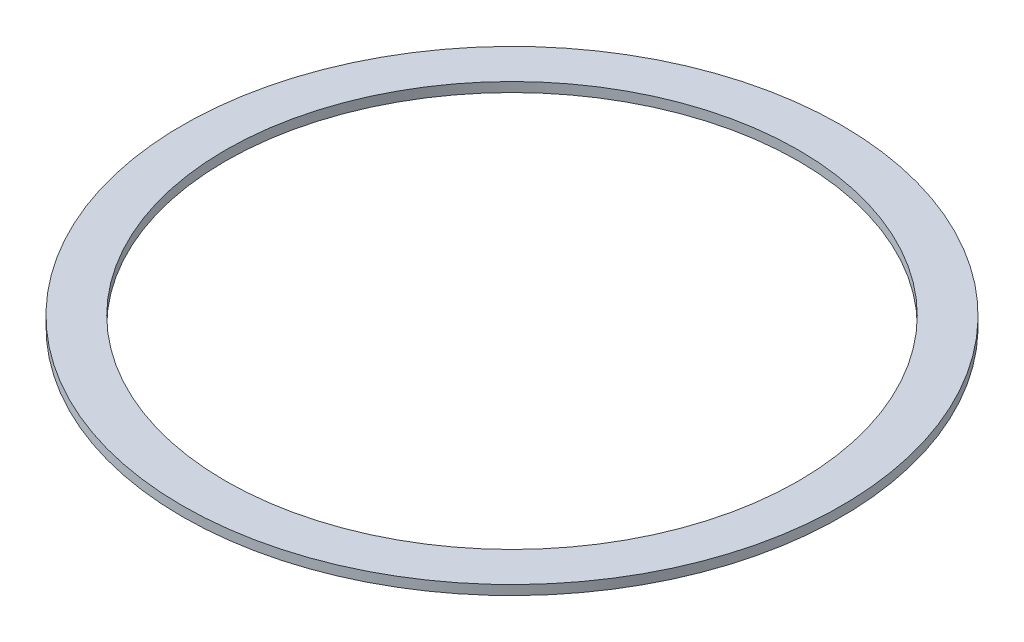
ISO-10303-21;
HEADER;
FILE_DESCRIPTION(('STEP AP214'),'2;1');
FILE_NAME('part.step','',(''),(''),'','','');
FILE_SCHEMA(('AUTOMOTIVE_DESIGN { 1 0 10303 214 1 1 1 1 }'));
ENDSEC;
DATA;
#1=APPLICATION_CONTEXT('core data for automotive mechanical design processes');
#2=APPLICATION_PROTOCOL_DEFINITION('international standard','automotive_design',2000,#1);
#3=PRODUCT_CONTEXT('',#1,'mechanical');
#4=PRODUCT('Part','Part','',(#3));
#5=PRODUCT_RELATED_PRODUCT_CATEGORY('part','',(#4));
#6=PRODUCT_DEFINITION_FORMATION('','',#4);
#7=PRODUCT_DEFINITION_CONTEXT('part definition',#1,'design');
#8=PRODUCT_DEFINITION('design','',#6,#7);
#9=PRODUCT_DEFINITION_SHAPE('','',#8);
#10=(LENGTH_UNIT() NAMED_UNIT(*) SI_UNIT(.MILLI.,.METRE.));
#11=(NAMED_UNIT(*) PLANE_ANGLE_UNIT() SI_UNIT($,.RADIAN.));
#12=(NAMED_UNIT(*) SI_UNIT($,.STERADIAN.) SOLID_ANGLE_UNIT());
#13=UNCERTAINTY_MEASURE_WITH_UNIT(LENGTH_MEASURE(1.E-05),#10,'distance_accuracy_value','');
#14=(GEOMETRIC_REPRESENTATION_CONTEXT(3) GLOBAL_UNCERTAINTY_ASSIGNED_CONTEXT((#13)) GLOBAL_UNIT_ASSIGNED_CONTEXT((#10,
#11,#12)) REPRESENTATION_CONTEXT('',''));
#15=CARTESIAN_POINT('',(0.,0.,0.));
#16=DIRECTION('',(0.,0.,1.));
#17=DIRECTION('',(1.,0.,0.));
#18=AXIS2_PLACEMENT_3D('',#15,#16,#17);
#19=CARTESIAN_POINT('',(0.,2.,0.));
#20=DIRECTION('',(0.,1.,0.));
#21=DIRECTION('',(0.,0.,1.));
#22=AXIS2_PLACEMENT_3D('',#19,#20,#21);
#23=PLANE('',#22);
#24=CARTESIAN_POINT('',(0.,2.,0.));
#25=DIRECTION('',(0.,1.,0.));
#26=DIRECTION('',(0.,0.,1.));
#27=AXIS2_PLACEMENT_3D('',#24,#25,#26);
#28=CIRCLE('',#27,69.);
#29=CARTESIAN_POINT('',(0.,2.,69.));
#30=VERTEX_POINT('',#29);
#31=EDGE_CURVE('E10',#30,#30,#28,.T.);
#32=ORIENTED_EDGE('',*,*,#31,.T.);
#33=EDGE_LOOP('',(#32));
#34=FACE_BOUND('',#33,.T.);
#35=CARTESIAN_POINT('',(0.,2.,0.));
#36=DIRECTION('',(0.,1.,0.));
#37=DIRECTION('',(0.,0.,1.));
#38=AXIS2_PLACEMENT_3D('',#35,#36,#37);
#39=CIRCLE('',#38,60.);
#40=CARTESIAN_POINT('',(0.,2.,60.));
#41=VERTEX_POINT('',#40);
#42=EDGE_CURVE('E50',#41,#41,#39,.T.);
#43=ORIENTED_EDGE('',*,*,#42,.F.);
#44=EDGE_LOOP('',(#43));
#45=FACE_BOUND('',#44,.T.);
#46=ADVANCED_FACE('F39',(#34,#45),#23,.T.);
#47=CARTESIAN_POINT('',(0.,0.,0.));
#48=DIRECTION('',(0.,1.,0.));
#49=DIRECTION('',(0.,0.,1.));
#50=AXIS2_PLACEMENT_3D('',#47,#48,#49);
#51=PLANE('',#50);
#52=CARTESIAN_POINT('',(0.,0.,0.));
#53=DIRECTION('',(0.,1.,0.));
#54=DIRECTION('',(0.,0.,1.));
#55=AXIS2_PLACEMENT_3D('',#52,#53,#54);
#56=CIRCLE('',#55,69.);
#57=CARTESIAN_POINT('',(0.,0.,69.));
#58=VERTEX_POINT('',#57);
#59=EDGE_CURVE('E43',#58,#58,#56,.T.);
#60=ORIENTED_EDGE('',*,*,#59,.F.);
#61=EDGE_LOOP('',(#60));
#62=FACE_BOUND('',#61,.T.);
#63=CARTESIAN_POINT('',(0.,0.,0.));
#64=DIRECTION('',(0.,1.,0.));
#65=DIRECTION('',(0.,0.,1.));
#66=AXIS2_PLACEMENT_3D('',#63,#64,#65);
#67=CIRCLE('',#66,60.);
#68=CARTESIAN_POINT('',(0.,0.,60.));
#69=VERTEX_POINT('',#68);
#70=EDGE_CURVE('E52',#69,#69,#67,.T.);
#71=ORIENTED_EDGE('',*,*,#70,.T.);
#72=EDGE_LOOP('',(#71));
#73=FACE_BOUND('',#72,.T.);
#74=ADVANCED_FACE('F62',(#62,#73),#51,.F.);
#75=CARTESIAN_POINT('',(0.,2.,0.));
#76=DIRECTION('',(0.,-1.,0.));
#77=DIRECTION('',(0.,0.,-1.));
#78=AXIS2_PLACEMENT_3D('',#75,#76,#77);
#79=CYLINDRICAL_SURFACE('',#78,69.);
#80=ORIENTED_EDGE('',*,*,#31,.F.);
#81=EDGE_LOOP('',(#80));
#82=FACE_BOUND('',#81,.T.);
#83=ORIENTED_EDGE('',*,*,#59,.T.);
#84=EDGE_LOOP('',(#83));
#85=FACE_BOUND('',#84,.T.);
#86=ADVANCED_FACE('F41',(#82,#85),#79,.T.);
#87=CARTESIAN_POINT('',(0.,2.,0.));
#88=DIRECTION('',(0.,-1.,0.));
#89=DIRECTION('',(0.,0.,-1.));
#90=AXIS2_PLACEMENT_3D('',#87,#88,#89);
#91=CYLINDRICAL_SURFACE('',#90,60.);
#92=ORIENTED_EDGE('',*,*,#42,.T.);
#93=EDGE_LOOP('',(#92));
#94=FACE_BOUND('',#93,.T.);
#95=ORIENTED_EDGE('',*,*,#70,.F.);
#96=EDGE_LOOP('',(#95));
#97=FACE_BOUND('',#96,.T.);
#98=ADVANCED_FACE('F58',(#94,#97),#91,.F.);
#99=CLOSED_SHELL('',(#46,#74,#86,#98));
#100=MANIFOLD_SOLID_BREP('B2',#99);
#101=ADVANCED_BREP_SHAPE_REPRESENTATION('',(#18,#100),#14);
#102=SHAPE_DEFINITION_REPRESENTATION(#9,#101);
ENDSEC;
END-ISO-10303-21;
